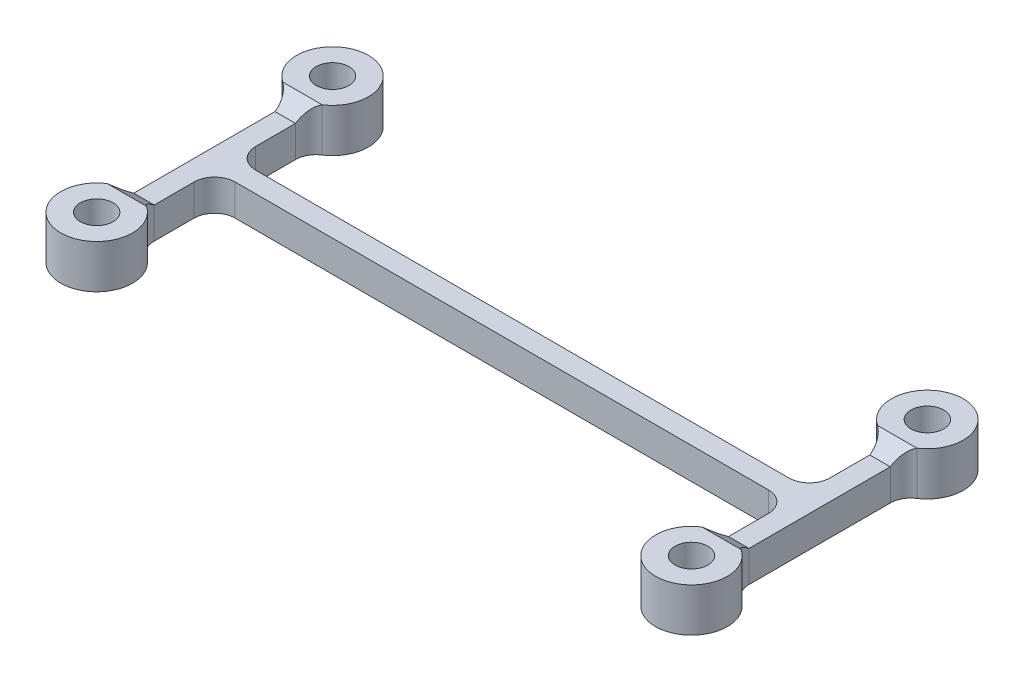
ISO-10303-21;
HEADER;
FILE_DESCRIPTION(('STEP AP214'),'2;1');
FILE_NAME('part.step','',(''),(''),'','','');
FILE_SCHEMA(('AUTOMOTIVE_DESIGN { 1 0 10303 214 1 1 1 1 }'));
ENDSEC;
DATA;
#1=APPLICATION_CONTEXT('core data for automotive mechanical design processes');
#2=APPLICATION_PROTOCOL_DEFINITION('international standard','automotive_design',2000,#1);
#3=PRODUCT_CONTEXT('',#1,'mechanical');
#4=PRODUCT('Part','Part','',(#3));
#5=PRODUCT_RELATED_PRODUCT_CATEGORY('part','',(#4));
#6=PRODUCT_DEFINITION_FORMATION('','',#4);
#7=PRODUCT_DEFINITION_CONTEXT('part definition',#1,'design');
#8=PRODUCT_DEFINITION('design','',#6,#7);
#9=PRODUCT_DEFINITION_SHAPE('','',#8);
#10=(LENGTH_UNIT() NAMED_UNIT(*) SI_UNIT(.MILLI.,.METRE.));
#11=(NAMED_UNIT(*) PLANE_ANGLE_UNIT() SI_UNIT($,.RADIAN.));
#12=(NAMED_UNIT(*) SI_UNIT($,.STERADIAN.) SOLID_ANGLE_UNIT());
#13=UNCERTAINTY_MEASURE_WITH_UNIT(LENGTH_MEASURE(1.E-05),#10,'distance_accuracy_value','');
#14=(GEOMETRIC_REPRESENTATION_CONTEXT(3) GLOBAL_UNCERTAINTY_ASSIGNED_CONTEXT((#13)) GLOBAL_UNIT_ASSIGNED_CONTEXT((#10,
#11,#12)) REPRESENTATION_CONTEXT('',''));
#15=CARTESIAN_POINT('',(0.,0.,0.));
#16=DIRECTION('',(0.,0.,1.));
#17=DIRECTION('',(1.,0.,0.));
#18=AXIS2_PLACEMENT_3D('',#15,#16,#17);
#19=CARTESIAN_POINT('',(32.,4.25,8.20884692923629));
#20=DIRECTION('',(0.,-1.,0.));
#21=DIRECTION('',(0.,0.,-1.));
#22=AXIS2_PLACEMENT_3D('',#19,#20,#21);
#23=PLANE('',#22);
#24=CARTESIAN_POINT('',(29.,4.25,12.8186191578828));
#25=DIRECTION('',(0.,1.,0.));
#26=DIRECTION('',(0.,0.,1.));
#27=AXIS2_PLACEMENT_3D('',#24,#25,#26);
#28=CIRCLE('',#27,1.6);
#29=CARTESIAN_POINT('',(29.,4.25,14.4186191578828));
#30=VERTEX_POINT('',#29);
#31=EDGE_CURVE('E405',#30,#30,#28,.T.);
#32=ORIENTED_EDGE('',*,*,#31,.F.);
#33=EDGE_LOOP('',(#32));
#34=FACE_BOUND('',#33,.T.);
#35=CARTESIAN_POINT('',(29.,4.25,12.8186191578828));
#36=DIRECTION('',(0.,1.,0.));
#37=DIRECTION('',(0.,0.,1.));
#38=AXIS2_PLACEMENT_3D('',#35,#36,#37);
#39=CIRCLE('',#38,3.5);
#40=CARTESIAN_POINT('',(27.0909090909091,4.25,9.88512773965318));
#41=VERTEX_POINT('',#40);
#42=CARTESIAN_POINT('',(30.9090909090909,4.25,9.88512773965318));
#43=VERTEX_POINT('',#42);
#44=EDGE_CURVE('E147',#41,#43,#39,.T.);
#45=ORIENTED_EDGE('',*,*,#44,.T.);
#46=DIRECTION('',(-1.,0.,0.));
#47=VECTOR('',#46,1.);
#48=CARTESIAN_POINT('',(32.,4.25,9.88512773965318));
#49=LINE('',#48,#47);
#50=EDGE_CURVE('E11',#43,#41,#49,.T.);
#51=ORIENTED_EDGE('',*,*,#50,.T.);
#52=EDGE_LOOP('',(#45,#51));
#53=FACE_BOUND('',#52,.T.);
#54=ADVANCED_FACE('F33',(#34,#53),#23,.F.);
#55=CARTESIAN_POINT('',(-29.,4.25,12.8186191578828));
#56=DIRECTION('',(0.,1.,0.));
#57=DIRECTION('',(0.,0.,1.));
#58=AXIS2_PLACEMENT_3D('',#55,#56,#57);
#59=CIRCLE('',#58,1.6);
#60=CARTESIAN_POINT('',(-29.,4.25,14.4186191578828));
#61=VERTEX_POINT('',#60);
#62=EDGE_CURVE('E387',#61,#61,#59,.T.);
#63=ORIENTED_EDGE('',*,*,#62,.F.);
#64=EDGE_LOOP('',(#63));
#65=FACE_BOUND('',#64,.T.);
#66=CARTESIAN_POINT('',(-29.,4.25,12.8186191578828));
#67=DIRECTION('',(0.,1.,0.));
#68=DIRECTION('',(0.,0.,1.));
#69=AXIS2_PLACEMENT_3D('',#66,#67,#68);
#70=CIRCLE('',#69,3.5);
#71=CARTESIAN_POINT('',(-30.9090909090909,4.25,9.88512773965318));
#72=VERTEX_POINT('',#71);
#73=CARTESIAN_POINT('',(-27.0909090909091,4.25,9.88512773965318));
#74=VERTEX_POINT('',#73);
#75=EDGE_CURVE('E230',#72,#74,#70,.T.);
#76=ORIENTED_EDGE('',*,*,#75,.T.);
#77=EDGE_CURVE('E37',#74,#72,#49,.T.);
#78=ORIENTED_EDGE('',*,*,#77,.T.);
#79=EDGE_LOOP('',(#76,#78));
#80=FACE_BOUND('',#79,.T.);
#81=ADVANCED_FACE('F227',(#65,#80),#23,.F.);
#82=CARTESIAN_POINT('',(-29.,4.25,-10.1813808421173));
#83=DIRECTION('',(0.,1.,0.));
#84=DIRECTION('',(0.,0.,1.));
#85=AXIS2_PLACEMENT_3D('',#82,#83,#84);
#86=CIRCLE('',#85,1.6);
#87=CARTESIAN_POINT('',(-29.,4.25,-8.58138084211725));
#88=VERTEX_POINT('',#87);
#89=EDGE_CURVE('E393',#88,#88,#86,.T.);
#90=ORIENTED_EDGE('',*,*,#89,.F.);
#91=EDGE_LOOP('',(#90));
#92=FACE_BOUND('',#91,.T.);
#93=CARTESIAN_POINT('',(-29.,4.25,-10.1813808421173));
#94=DIRECTION('',(0.,1.,0.));
#95=DIRECTION('',(0.,0.,1.));
#96=AXIS2_PLACEMENT_3D('',#93,#94,#95);
#97=CIRCLE('',#96,3.5);
#98=CARTESIAN_POINT('',(-27.0909090909091,4.25,-7.2478894238877));
#99=VERTEX_POINT('',#98);
#100=CARTESIAN_POINT('',(-30.9090909090909,4.25,-7.2478894238877));
#101=VERTEX_POINT('',#100);
#102=EDGE_CURVE('E158',#99,#101,#97,.T.);
#103=ORIENTED_EDGE('',*,*,#102,.T.);
#104=DIRECTION('',(1.,0.,0.));
#105=VECTOR('',#104,1.);
#106=CARTESIAN_POINT('',(32.,4.25,-7.2478894238877));
#107=LINE('',#106,#105);
#108=EDGE_CURVE('E212',#101,#99,#107,.T.);
#109=ORIENTED_EDGE('',*,*,#108,.T.);
#110=EDGE_LOOP('',(#103,#109));
#111=FACE_BOUND('',#110,.T.);
#112=ADVANCED_FACE('F530',(#92,#111),#23,.F.);
#113=CARTESIAN_POINT('',(32.,4.25,8.20884692923629));
#114=DIRECTION('',(0.,-1.,0.));
#115=DIRECTION('',(0.,0.,-1.));
#116=AXIS2_PLACEMENT_3D('',#113,#114,#115);
#117=CYLINDRICAL_SURFACE('',#116,2.);
#118=DIRECTION('',(0.,-1.,0.));
#119=VECTOR('',#118,1.);
#120=CARTESIAN_POINT('',(30.,4.25,8.20884692923629));
#121=LINE('',#120,#119);
#122=CARTESIAN_POINT('',(30.,3.05547270683732,8.20884692923629));
#123=VERTEX_POINT('',#122);
#124=CARTESIAN_POINT('',(30.,0.,8.20884692923629));
#125=VERTEX_POINT('',#124);
#126=EDGE_CURVE('E210',#123,#125,#121,.T.);
#127=ORIENTED_EDGE('',*,*,#126,.F.);
#128=CARTESIAN_POINT('',(32.,3.05547270683732,8.20884692923629));
#129=DIRECTION('',(0.,-0.81438006686052,0.580331893574923));
#130=DIRECTION('',(0.,-0.580331893574923,-0.81438006686052));
#131=AXIS2_PLACEMENT_3D('',#128,#129,#130);
#132=ELLIPSE('',#131,2.4558557869793,2.);
#133=EDGE_CURVE('E352',#123,#43,#132,.F.);
#134=ORIENTED_EDGE('',*,*,#133,.T.);
#135=DIRECTION('',(0.,-1.,0.));
#136=VECTOR('',#135,1.);
#137=CARTESIAN_POINT('',(30.9090909090909,4.25,9.88512773965318));
#138=LINE('',#137,#136);
#139=CARTESIAN_POINT('',(30.9090909090909,0.,9.88512773965318));
#140=VERTEX_POINT('',#139);
#141=EDGE_CURVE('E148',#43,#140,#138,.T.);
#142=ORIENTED_EDGE('',*,*,#141,.T.);
#143=CARTESIAN_POINT('',(32.,0.,8.20884692923629));
#144=DIRECTION('',(0.,-1.,0.));
#145=DIRECTION('',(0.,0.,-1.));
#146=AXIS2_PLACEMENT_3D('',#143,#144,#145);
#147=CIRCLE('',#146,2.);
#148=EDGE_CURVE('E154',#140,#125,#147,.T.);
#149=ORIENTED_EDGE('',*,*,#148,.T.);
#150=EDGE_LOOP('',(#127,#134,#142,#149));
#151=FACE_BOUND('',#150,.T.);
#152=ADVANCED_FACE('F35',(#151),#117,.F.);
#153=CARTESIAN_POINT('',(30.,4.25,-5.57160861347081));
#154=DIRECTION('',(-1.,0.,0.));
#155=DIRECTION('',(0.,0.,1.));
#156=AXIS2_PLACEMENT_3D('',#153,#154,#155);
#157=PLANE('',#156);
#158=DIRECTION('',(0.,-1.,0.));
#159=VECTOR('',#158,1.);
#160=CARTESIAN_POINT('',(30.,4.25,-5.57160861347081));
#161=LINE('',#160,#159);
#162=CARTESIAN_POINT('',(30.,3.05547270683732,-5.57160861347081));
#163=VERTEX_POINT('',#162);
#164=CARTESIAN_POINT('',(30.,0.,-5.57160861347081));
#165=VERTEX_POINT('',#164);
#166=EDGE_CURVE('E208',#163,#165,#161,.T.);
#167=ORIENTED_EDGE('',*,*,#166,.F.);
#168=DIRECTION('',(0.,0.,1.));
#169=VECTOR('',#168,1.);
#170=CARTESIAN_POINT('',(30.,3.05547270683732,-5.57160861347081));
#171=LINE('',#170,#169);
#172=EDGE_CURVE('E384',#163,#123,#171,.T.);
#173=ORIENTED_EDGE('',*,*,#172,.T.);
#174=ORIENTED_EDGE('',*,*,#126,.T.);
#175=DIRECTION('',(0.,0.,-1.));
#176=VECTOR('',#175,1.);
#177=CARTESIAN_POINT('',(30.,0.,-5.57160861347081));
#178=LINE('',#177,#176);
#179=EDGE_CURVE('E254',#125,#165,#178,.T.);
#180=ORIENTED_EDGE('',*,*,#179,.T.);
#181=EDGE_LOOP('',(#167,#173,#174,#180));
#182=FACE_BOUND('',#181,.T.);
#183=ADVANCED_FACE('F446',(#182),#157,.F.);
#184=CARTESIAN_POINT('',(32.,4.25,-5.57160861347081));
#185=DIRECTION('',(0.,-1.,0.));
#186=DIRECTION('',(0.,0.,-1.));
#187=AXIS2_PLACEMENT_3D('',#184,#185,#186);
#188=CYLINDRICAL_SURFACE('',#187,2.);
#189=DIRECTION('',(0.,-1.,0.));
#190=VECTOR('',#189,1.);
#191=CARTESIAN_POINT('',(30.9090909090909,4.25,-7.2478894238877));
#192=LINE('',#191,#190);
#193=CARTESIAN_POINT('',(30.9090909090909,4.25,-7.2478894238877));
#194=VERTEX_POINT('',#193);
#195=CARTESIAN_POINT('',(30.9090909090909,0.,-7.2478894238877));
#196=VERTEX_POINT('',#195);
#197=EDGE_CURVE('E205',#194,#196,#192,.T.);
#198=ORIENTED_EDGE('',*,*,#197,.F.);
#199=CARTESIAN_POINT('',(32.,3.05547270683732,-5.57160861347081));
#200=DIRECTION('',(0.,-0.814380066860519,-0.580331893574924));
#201=DIRECTION('',(0.,-0.580331893574924,0.814380066860519));
#202=AXIS2_PLACEMENT_3D('',#199,#200,#201);
#203=ELLIPSE('',#202,2.45585578697931,2.);
#204=EDGE_CURVE('E49',#194,#163,#203,.F.);
#205=ORIENTED_EDGE('',*,*,#204,.T.);
#206=ORIENTED_EDGE('',*,*,#166,.T.);
#207=CARTESIAN_POINT('',(32.,0.,-5.57160861347081));
#208=DIRECTION('',(0.,-1.,0.));
#209=DIRECTION('',(0.,0.,-1.));
#210=AXIS2_PLACEMENT_3D('',#207,#208,#209);
#211=CIRCLE('',#210,2.);
#212=EDGE_CURVE('E258',#165,#196,#211,.T.);
#213=ORIENTED_EDGE('',*,*,#212,.T.);
#214=EDGE_LOOP('',(#198,#205,#206,#213));
#215=FACE_BOUND('',#214,.T.);
#216=ADVANCED_FACE('F451',(#215),#188,.F.);
#217=CARTESIAN_POINT('',(29.,4.25,-10.1813808421173));
#218=DIRECTION('',(0.,-1.,0.));
#219=DIRECTION('',(0.,0.,-1.));
#220=AXIS2_PLACEMENT_3D('',#217,#218,#219);
#221=CYLINDRICAL_SURFACE('',#220,3.5);
#222=CARTESIAN_POINT('',(29.,0.,-10.1813808421173));
#223=DIRECTION('',(0.,1.,0.));
#224=DIRECTION('',(0.,0.,1.));
#225=AXIS2_PLACEMENT_3D('',#222,#223,#224);
#226=CIRCLE('',#225,3.5);
#227=CARTESIAN_POINT('',(27.0909090909091,0.,-7.2478894238877));
#228=VERTEX_POINT('',#227);
#229=EDGE_CURVE('E260',#196,#228,#226,.T.);
#230=ORIENTED_EDGE('',*,*,#229,.T.);
#231=DIRECTION('',(0.,-1.,0.));
#232=VECTOR('',#231,1.);
#233=CARTESIAN_POINT('',(27.0909090909091,4.25,-7.2478894238877));
#234=LINE('',#233,#232);
#235=CARTESIAN_POINT('',(27.0909090909091,4.25,-7.2478894238877));
#236=VERTEX_POINT('',#235);
#237=EDGE_CURVE('E202',#236,#228,#234,.T.);
#238=ORIENTED_EDGE('',*,*,#237,.F.);
#239=CARTESIAN_POINT('',(29.,4.25,-10.1813808421173));
#240=DIRECTION('',(0.,1.,0.));
#241=DIRECTION('',(0.,0.,1.));
#242=AXIS2_PLACEMENT_3D('',#239,#240,#241);
#243=CIRCLE('',#242,3.5);
#244=EDGE_CURVE('E155',#194,#236,#243,.T.);
#245=ORIENTED_EDGE('',*,*,#244,.F.);
#246=ORIENTED_EDGE('',*,*,#197,.T.);
#247=EDGE_LOOP('',(#230,#238,#245,#246));
#248=FACE_BOUND('',#247,.T.);
#249=ADVANCED_FACE('F539',(#248),#221,.T.);
#250=CARTESIAN_POINT('',(26.,4.25,-5.57160861347081));
#251=DIRECTION('',(0.,-1.,0.));
#252=DIRECTION('',(0.,0.,-1.));
#253=AXIS2_PLACEMENT_3D('',#250,#251,#252);
#254=CYLINDRICAL_SURFACE('',#253,2.);
#255=DIRECTION('',(0.,-1.,0.));
#256=VECTOR('',#255,1.);
#257=CARTESIAN_POINT('',(28.,4.25,-5.57160861347081));
#258=LINE('',#257,#256);
#259=CARTESIAN_POINT('',(28.,3.05547270683732,-5.57160861347081));
#260=VERTEX_POINT('',#259);
#261=CARTESIAN_POINT('',(28.,0.,-5.57160861347081));
#262=VERTEX_POINT('',#261);
#263=EDGE_CURVE('E200',#260,#262,#258,.T.);
#264=ORIENTED_EDGE('',*,*,#263,.F.);
#265=CARTESIAN_POINT('',(26.,3.05547270683732,-5.57160861347081));
#266=DIRECTION('',(0.,-0.814380066860519,-0.580331893574924));
#267=DIRECTION('',(0.,-0.580331893574924,0.814380066860519));
#268=AXIS2_PLACEMENT_3D('',#265,#266,#267);
#269=ELLIPSE('',#268,2.45585578697931,2.);
#270=EDGE_CURVE('E453',#260,#236,#269,.F.);
#271=ORIENTED_EDGE('',*,*,#270,.T.);
#272=ORIENTED_EDGE('',*,*,#237,.T.);
#273=CARTESIAN_POINT('',(26.,0.,-5.57160861347081));
#274=DIRECTION('',(0.,-1.,0.));
#275=DIRECTION('',(0.,0.,1.));
#276=AXIS2_PLACEMENT_3D('',#273,#274,#275);
#277=CIRCLE('',#276,2.);
#278=EDGE_CURVE('E262',#228,#262,#277,.T.);
#279=ORIENTED_EDGE('',*,*,#278,.T.);
#280=EDGE_LOOP('',(#264,#271,#272,#279));
#281=FACE_BOUND('',#280,.T.);
#282=ADVANCED_FACE('F536',(#281),#254,.F.);
#283=CARTESIAN_POINT('',(28.,4.25,-5.57160861347081));
#284=DIRECTION('',(1.,0.,0.));
#285=DIRECTION('',(0.,0.,-1.));
#286=AXIS2_PLACEMENT_3D('',#283,#284,#285);
#287=PLANE('',#286);
#288=DIRECTION('',(0.,-1.,0.));
#289=VECTOR('',#288,1.);
#290=CARTESIAN_POINT('',(28.,4.25,-1.68138084211727));
#291=LINE('',#290,#289);
#292=CARTESIAN_POINT('',(28.,3.05547270683732,-1.68138084211727));
#293=VERTEX_POINT('',#292);
#294=CARTESIAN_POINT('',(28.,0.,-1.68138084211727));
#295=VERTEX_POINT('',#294);
#296=EDGE_CURVE('E198',#293,#295,#291,.T.);
#297=ORIENTED_EDGE('',*,*,#296,.F.);
#298=DIRECTION('',(0.,0.,-1.));
#299=VECTOR('',#298,1.);
#300=CARTESIAN_POINT('',(28.,3.05547270683732,-5.57160861347081));
#301=LINE('',#300,#299);
#302=EDGE_CURVE('E381',#293,#260,#301,.T.);
#303=ORIENTED_EDGE('',*,*,#302,.T.);
#304=ORIENTED_EDGE('',*,*,#263,.T.);
#305=DIRECTION('',(0.,0.,1.));
#306=VECTOR('',#305,1.);
#307=CARTESIAN_POINT('',(28.,0.,-5.57160861347081));
#308=LINE('',#307,#306);
#309=EDGE_CURVE('E265',#262,#295,#308,.T.);
#310=ORIENTED_EDGE('',*,*,#309,.T.);
#311=EDGE_LOOP('',(#297,#303,#304,#310));
#312=FACE_BOUND('',#311,.T.);
#313=ADVANCED_FACE('F495',(#312),#287,.F.);
#314=CARTESIAN_POINT('',(26.,4.25,-1.68138084211725));
#315=DIRECTION('',(0.,-1.,0.));
#316=DIRECTION('',(0.,0.,-1.));
#317=AXIS2_PLACEMENT_3D('',#314,#315,#316);
#318=CYLINDRICAL_SURFACE('',#317,2.);
#319=DIRECTION('',(0.,-1.,0.));
#320=VECTOR('',#319,1.);
#321=CARTESIAN_POINT('',(26.,4.25,0.318619157882749));
#322=LINE('',#321,#320);
#323=CARTESIAN_POINT('',(26.,3.05547270683732,0.318619157882749));
#324=VERTEX_POINT('',#323);
#325=CARTESIAN_POINT('',(26.,0.,0.318619157882749));
#326=VERTEX_POINT('',#325);
#327=EDGE_CURVE('E196',#324,#326,#322,.T.);
#328=ORIENTED_EDGE('',*,*,#327,.F.);
#329=CARTESIAN_POINT('',(26.,3.05547270683732,-1.68138084211725));
#330=DIRECTION('',(0.,-1.,0.));
#331=DIRECTION('',(0.,0.,-1.));
#332=AXIS2_PLACEMENT_3D('',#329,#330,#331);
#333=CIRCLE('',#332,2.);
#334=EDGE_CURVE('E378',#324,#293,#333,.F.);
#335=ORIENTED_EDGE('',*,*,#334,.T.);
#336=ORIENTED_EDGE('',*,*,#296,.T.);
#337=CARTESIAN_POINT('',(26.,0.,-1.68138084211725));
#338=DIRECTION('',(0.,-1.,0.));
#339=DIRECTION('',(0.,0.,1.));
#340=AXIS2_PLACEMENT_3D('',#337,#338,#339);
#341=CIRCLE('',#340,2.);
#342=EDGE_CURVE('E268',#295,#326,#341,.T.);
#343=ORIENTED_EDGE('',*,*,#342,.T.);
#344=EDGE_LOOP('',(#328,#335,#336,#343));
#345=FACE_BOUND('',#344,.T.);
#346=ADVANCED_FACE('F494',(#345),#318,.F.);
#347=CARTESIAN_POINT('',(-26.,4.25,0.318619157882749));
#348=DIRECTION('',(0.,0.,1.));
#349=DIRECTION('',(1.,0.,0.));
#350=AXIS2_PLACEMENT_3D('',#347,#348,#349);
#351=PLANE('',#350);
#352=DIRECTION('',(0.,-1.,0.));
#353=VECTOR('',#352,1.);
#354=CARTESIAN_POINT('',(-26.,4.25,0.318619157882749));
#355=LINE('',#354,#353);
#356=CARTESIAN_POINT('',(-26.,3.05547270683732,0.318619157882749));
#357=VERTEX_POINT('',#356);
#358=CARTESIAN_POINT('',(-26.,0.,0.318619157882749));
#359=VERTEX_POINT('',#358);
#360=EDGE_CURVE('E194',#357,#359,#355,.T.);
#361=ORIENTED_EDGE('',*,*,#360,.F.);
#362=DIRECTION('',(1.,0.,0.));
#363=VECTOR('',#362,1.);
#364=CARTESIAN_POINT('',(-26.,3.05547270683732,0.318619157882749));
#365=LINE('',#364,#363);
#366=EDGE_CURVE('E375',#357,#324,#365,.T.);
#367=ORIENTED_EDGE('',*,*,#366,.T.);
#368=ORIENTED_EDGE('',*,*,#327,.T.);
#369=DIRECTION('',(-1.,0.,0.));
#370=VECTOR('',#369,1.);
#371=CARTESIAN_POINT('',(-26.,0.,0.318619157882749));
#372=LINE('',#371,#370);
#373=EDGE_CURVE('E271',#326,#359,#372,.T.);
#374=ORIENTED_EDGE('',*,*,#373,.T.);
#375=EDGE_LOOP('',(#361,#367,#368,#374));
#376=FACE_BOUND('',#375,.T.);
#377=ADVANCED_FACE('F504',(#376),#351,.F.);
#378=CARTESIAN_POINT('',(-26.,4.25,-1.68138084211725));
#379=DIRECTION('',(0.,-1.,0.));
#380=DIRECTION('',(0.,0.,-1.));
#381=AXIS2_PLACEMENT_3D('',#378,#379,#380);
#382=CYLINDRICAL_SURFACE('',#381,2.);
#383=DIRECTION('',(0.,-1.,0.));
#384=VECTOR('',#383,1.);
#385=CARTESIAN_POINT('',(-28.,4.25,-1.68138084211727));
#386=LINE('',#385,#384);
#387=CARTESIAN_POINT('',(-28.,3.05547270683732,-1.68138084211727));
#388=VERTEX_POINT('',#387);
#389=CARTESIAN_POINT('',(-28.,0.,-1.68138084211727));
#390=VERTEX_POINT('',#389);
#391=EDGE_CURVE('E192',#388,#390,#386,.T.);
#392=ORIENTED_EDGE('',*,*,#391,.F.);
#393=CARTESIAN_POINT('',(-26.,3.05547270683732,-1.68138084211725));
#394=DIRECTION('',(0.,-1.,0.));
#395=DIRECTION('',(0.,0.,-1.));
#396=AXIS2_PLACEMENT_3D('',#393,#394,#395);
#397=CIRCLE('',#396,2.);
#398=EDGE_CURVE('E372',#388,#357,#397,.F.);
#399=ORIENTED_EDGE('',*,*,#398,.T.);
#400=ORIENTED_EDGE('',*,*,#360,.T.);
#401=CARTESIAN_POINT('',(-26.,0.,-1.68138084211725));
#402=DIRECTION('',(0.,-1.,0.));
#403=DIRECTION('',(0.,0.,-1.));
#404=AXIS2_PLACEMENT_3D('',#401,#402,#403);
#405=CIRCLE('',#404,2.);
#406=EDGE_CURVE('E274',#359,#390,#405,.T.);
#407=ORIENTED_EDGE('',*,*,#406,.T.);
#408=EDGE_LOOP('',(#392,#399,#400,#407));
#409=FACE_BOUND('',#408,.T.);
#410=ADVANCED_FACE('F508',(#409),#382,.F.);
#411=CARTESIAN_POINT('',(-28.,4.25,-5.57160861347081));
#412=DIRECTION('',(-1.,0.,0.));
#413=DIRECTION('',(0.,0.,1.));
#414=AXIS2_PLACEMENT_3D('',#411,#412,#413);
#415=PLANE('',#414);
#416=DIRECTION('',(0.,-1.,0.));
#417=VECTOR('',#416,1.);
#418=CARTESIAN_POINT('',(-28.,4.25,-5.57160861347081));
#419=LINE('',#418,#417);
#420=CARTESIAN_POINT('',(-28.,3.05547270683732,-5.57160861347081));
#421=VERTEX_POINT('',#420);
#422=CARTESIAN_POINT('',(-28.,0.,-5.57160861347081));
#423=VERTEX_POINT('',#422);
#424=EDGE_CURVE('E190',#421,#423,#419,.T.);
#425=ORIENTED_EDGE('',*,*,#424,.F.);
#426=DIRECTION('',(0.,0.,1.));
#427=VECTOR('',#426,1.);
#428=CARTESIAN_POINT('',(-28.,3.05547270683732,-5.57160861347081));
#429=LINE('',#428,#427);
#430=EDGE_CURVE('E369',#421,#388,#429,.T.);
#431=ORIENTED_EDGE('',*,*,#430,.T.);
#432=ORIENTED_EDGE('',*,*,#391,.T.);
#433=DIRECTION('',(0.,0.,-1.));
#434=VECTOR('',#433,1.);
#435=CARTESIAN_POINT('',(-28.,0.,-5.57160861347081));
#436=LINE('',#435,#434);
#437=EDGE_CURVE('E277',#390,#423,#436,.T.);
#438=ORIENTED_EDGE('',*,*,#437,.T.);
#439=EDGE_LOOP('',(#425,#431,#432,#438));
#440=FACE_BOUND('',#439,.T.);
#441=ADVANCED_FACE('F511',(#440),#415,.F.);
#442=CARTESIAN_POINT('',(-26.,4.25,-5.57160861347081));
#443=DIRECTION('',(0.,-1.,0.));
#444=DIRECTION('',(0.,0.,-1.));
#445=AXIS2_PLACEMENT_3D('',#442,#443,#444);
#446=CYLINDRICAL_SURFACE('',#445,2.);
#447=DIRECTION('',(0.,-1.,0.));
#448=VECTOR('',#447,1.);
#449=CARTESIAN_POINT('',(-27.0909090909091,4.25,-7.2478894238877));
#450=LINE('',#449,#448);
#451=CARTESIAN_POINT('',(-27.0909090909091,0.,-7.2478894238877));
#452=VERTEX_POINT('',#451);
#453=EDGE_CURVE('E187',#99,#452,#450,.T.);
#454=ORIENTED_EDGE('',*,*,#453,.F.);
#455=CARTESIAN_POINT('',(-26.,3.05547270683732,-5.57160861347081));
#456=DIRECTION('',(0.,-0.814380066860519,-0.580331893574924));
#457=DIRECTION('',(0.,-0.580331893574924,0.814380066860519));
#458=AXIS2_PLACEMENT_3D('',#455,#456,#457);
#459=ELLIPSE('',#458,2.45585578697931,2.);
#460=EDGE_CURVE('E455',#99,#421,#459,.F.);
#461=ORIENTED_EDGE('',*,*,#460,.T.);
#462=ORIENTED_EDGE('',*,*,#424,.T.);
#463=CARTESIAN_POINT('',(-26.,0.,-5.57160861347081));
#464=DIRECTION('',(0.,-1.,0.));
#465=DIRECTION('',(0.,0.,1.));
#466=AXIS2_PLACEMENT_3D('',#463,#464,#465);
#467=CIRCLE('',#466,2.);
#468=EDGE_CURVE('E280',#423,#452,#467,.T.);
#469=ORIENTED_EDGE('',*,*,#468,.T.);
#470=EDGE_LOOP('',(#454,#461,#462,#469));
#471=FACE_BOUND('',#470,.T.);
#472=ADVANCED_FACE('F521',(#471),#446,.F.);
#473=CARTESIAN_POINT('',(-29.,4.25,-10.1813808421173));
#474=DIRECTION('',(0.,-1.,0.));
#475=DIRECTION('',(0.,0.,-1.));
#476=AXIS2_PLACEMENT_3D('',#473,#474,#475);
#477=CYLINDRICAL_SURFACE('',#476,3.5);
#478=CARTESIAN_POINT('',(-29.,0.,-10.1813808421173));
#479=DIRECTION('',(0.,1.,0.));
#480=DIRECTION('',(0.,0.,1.));
#481=AXIS2_PLACEMENT_3D('',#478,#479,#480);
#482=CIRCLE('',#481,3.5);
#483=CARTESIAN_POINT('',(-30.9090909090909,0.,-7.2478894238877));
#484=VERTEX_POINT('',#483);
#485=EDGE_CURVE('E282',#452,#484,#482,.T.);
#486=ORIENTED_EDGE('',*,*,#485,.T.);
#487=DIRECTION('',(0.,-1.,0.));
#488=VECTOR('',#487,1.);
#489=CARTESIAN_POINT('',(-30.9090909090909,4.25,-7.2478894238877));
#490=LINE('',#489,#488);
#491=EDGE_CURVE('E184',#101,#484,#490,.T.);
#492=ORIENTED_EDGE('',*,*,#491,.F.);
#493=ORIENTED_EDGE('',*,*,#102,.F.);
#494=ORIENTED_EDGE('',*,*,#453,.T.);
#495=EDGE_LOOP('',(#486,#492,#493,#494));
#496=FACE_BOUND('',#495,.T.);
#497=ADVANCED_FACE('F529',(#496),#477,.T.);
#498=CARTESIAN_POINT('',(-32.,4.25,-5.57160861347081));
#499=DIRECTION('',(0.,-1.,0.));
#500=DIRECTION('',(0.,0.,-1.));
#501=AXIS2_PLACEMENT_3D('',#498,#499,#500);
#502=CYLINDRICAL_SURFACE('',#501,2.);
#503=DIRECTION('',(0.,-1.,0.));
#504=VECTOR('',#503,1.);
#505=CARTESIAN_POINT('',(-30.,4.25,-5.57160861347081));
#506=LINE('',#505,#504);
#507=CARTESIAN_POINT('',(-30.,3.05547270683732,-5.57160861347081));
#508=VERTEX_POINT('',#507);
#509=CARTESIAN_POINT('',(-30.,0.,-5.57160861347081));
#510=VERTEX_POINT('',#509);
#511=EDGE_CURVE('E182',#508,#510,#506,.T.);
#512=ORIENTED_EDGE('',*,*,#511,.F.);
#513=CARTESIAN_POINT('',(-32.,3.05547270683732,-5.57160861347081));
#514=DIRECTION('',(0.,-0.814380066860519,-0.580331893574924));
#515=DIRECTION('',(0.,-0.580331893574924,0.814380066860519));
#516=AXIS2_PLACEMENT_3D('',#513,#514,#515);
#517=ELLIPSE('',#516,2.45585578697931,2.);
#518=EDGE_CURVE('E460',#508,#101,#517,.F.);
#519=ORIENTED_EDGE('',*,*,#518,.T.);
#520=ORIENTED_EDGE('',*,*,#491,.T.);
#521=CARTESIAN_POINT('',(-32.,0.,-5.57160861347081));
#522=DIRECTION('',(0.,-1.,0.));
#523=DIRECTION('',(0.,0.,1.));
#524=AXIS2_PLACEMENT_3D('',#521,#522,#523);
#525=CIRCLE('',#524,2.);
#526=EDGE_CURVE('E284',#484,#510,#525,.T.);
#527=ORIENTED_EDGE('',*,*,#526,.T.);
#528=EDGE_LOOP('',(#512,#519,#520,#527));
#529=FACE_BOUND('',#528,.T.);
#530=ADVANCED_FACE('F716',(#529),#502,.F.);
#531=CARTESIAN_POINT('',(-30.,4.25,-5.57160861347081));
#532=DIRECTION('',(1.,0.,0.));
#533=DIRECTION('',(0.,0.,-1.));
#534=AXIS2_PLACEMENT_3D('',#531,#532,#533);
#535=PLANE('',#534);
#536=DIRECTION('',(0.,-1.,0.));
#537=VECTOR('',#536,1.);
#538=CARTESIAN_POINT('',(-30.,4.25,8.20884692923633));
#539=LINE('',#538,#537);
#540=CARTESIAN_POINT('',(-30.,3.05547270683732,8.20884692923629));
#541=VERTEX_POINT('',#540);
#542=CARTESIAN_POINT('',(-30.,0.,8.20884692923633));
#543=VERTEX_POINT('',#542);
#544=EDGE_CURVE('E180',#541,#543,#539,.T.);
#545=ORIENTED_EDGE('',*,*,#544,.F.);
#546=DIRECTION('',(0.,0.,-1.));
#547=VECTOR('',#546,1.);
#548=CARTESIAN_POINT('',(-30.,3.05547270683732,-5.57160861347081));
#549=LINE('',#548,#547);
#550=EDGE_CURVE('E366',#541,#508,#549,.T.);
#551=ORIENTED_EDGE('',*,*,#550,.T.);
#552=ORIENTED_EDGE('',*,*,#511,.T.);
#553=DIRECTION('',(0.,0.,1.));
#554=VECTOR('',#553,1.);
#555=CARTESIAN_POINT('',(-30.,0.,-5.57160861347081));
#556=LINE('',#555,#554);
#557=EDGE_CURVE('E287',#510,#543,#556,.T.);
#558=ORIENTED_EDGE('',*,*,#557,.T.);
#559=EDGE_LOOP('',(#545,#551,#552,#558));
#560=FACE_BOUND('',#559,.T.);
#561=ADVANCED_FACE('F708',(#560),#535,.F.);
#562=CARTESIAN_POINT('',(-32.,4.25,8.20884692923633));
#563=DIRECTION('',(0.,-1.,0.));
#564=DIRECTION('',(0.,0.,-1.));
#565=AXIS2_PLACEMENT_3D('',#562,#563,#564);
#566=CYLINDRICAL_SURFACE('',#565,2.);
#567=DIRECTION('',(0.,-1.,0.));
#568=VECTOR('',#567,1.);
#569=CARTESIAN_POINT('',(-30.9090909090909,4.25,9.88512773965321));
#570=LINE('',#569,#568);
#571=CARTESIAN_POINT('',(-30.9090909090909,0.,9.88512773965321));
#572=VERTEX_POINT('',#571);
#573=EDGE_CURVE('E177',#72,#572,#570,.T.);
#574=ORIENTED_EDGE('',*,*,#573,.F.);
#575=CARTESIAN_POINT('',(-32.,3.05547270683734,8.20884692923633));
#576=DIRECTION('',(0.,-0.81438006686052,0.580331893574923));
#577=DIRECTION('',(0.,-0.580331893574923,-0.81438006686052));
#578=AXIS2_PLACEMENT_3D('',#575,#576,#577);
#579=ELLIPSE('',#578,2.45585578697931,2.);
#580=EDGE_CURVE('E242',#72,#541,#579,.F.);
#581=ORIENTED_EDGE('',*,*,#580,.T.);
#582=ORIENTED_EDGE('',*,*,#544,.T.);
#583=CARTESIAN_POINT('',(-32.,0.,8.20884692923633));
#584=DIRECTION('',(0.,-1.,0.));
#585=DIRECTION('',(0.,0.,1.));
#586=AXIS2_PLACEMENT_3D('',#583,#584,#585);
#587=CIRCLE('',#586,2.);
#588=EDGE_CURVE('E245',#543,#572,#587,.T.);
#589=ORIENTED_EDGE('',*,*,#588,.T.);
#590=EDGE_LOOP('',(#574,#581,#582,#589));
#591=FACE_BOUND('',#590,.T.);
#592=ADVANCED_FACE('F240',(#591),#566,.F.);
#593=CARTESIAN_POINT('',(-29.,4.25,12.8186191578828));
#594=DIRECTION('',(0.,-1.,0.));
#595=DIRECTION('',(0.,0.,-1.));
#596=AXIS2_PLACEMENT_3D('',#593,#594,#595);
#597=CYLINDRICAL_SURFACE('',#596,3.5);
#598=CARTESIAN_POINT('',(-29.,0.,12.8186191578828));
#599=DIRECTION('',(0.,1.,0.));
#600=DIRECTION('',(0.,0.,1.));
#601=AXIS2_PLACEMENT_3D('',#598,#599,#600);
#602=CIRCLE('',#601,3.5);
#603=CARTESIAN_POINT('',(-27.0909090909091,0.,9.88512773965319));
#604=VERTEX_POINT('',#603);
#605=EDGE_CURVE('E291',#572,#604,#602,.T.);
#606=ORIENTED_EDGE('',*,*,#605,.T.);
#607=DIRECTION('',(0.,-1.,0.));
#608=VECTOR('',#607,1.);
#609=CARTESIAN_POINT('',(-27.0909090909091,4.25,9.88512773965319));
#610=LINE('',#609,#608);
#611=EDGE_CURVE('E174',#74,#604,#610,.T.);
#612=ORIENTED_EDGE('',*,*,#611,.F.);
#613=ORIENTED_EDGE('',*,*,#75,.F.);
#614=ORIENTED_EDGE('',*,*,#573,.T.);
#615=EDGE_LOOP('',(#606,#612,#613,#614));
#616=FACE_BOUND('',#615,.T.);
#617=ADVANCED_FACE('F248',(#616),#597,.T.);
#618=CARTESIAN_POINT('',(-26.,4.25,8.20884692923629));
#619=DIRECTION('',(0.,-1.,0.));
#620=DIRECTION('',(0.,0.,-1.));
#621=AXIS2_PLACEMENT_3D('',#618,#619,#620);
#622=CYLINDRICAL_SURFACE('',#621,2.);
#623=DIRECTION('',(0.,-1.,0.));
#624=VECTOR('',#623,1.);
#625=CARTESIAN_POINT('',(-28.,4.25,8.20884692923629));
#626=LINE('',#625,#624);
#627=CARTESIAN_POINT('',(-28.,3.05547270683732,8.20884692923629));
#628=VERTEX_POINT('',#627);
#629=CARTESIAN_POINT('',(-28.,0.,8.20884692923629));
#630=VERTEX_POINT('',#629);
#631=EDGE_CURVE('E172',#628,#630,#626,.T.);
#632=ORIENTED_EDGE('',*,*,#631,.F.);
#633=CARTESIAN_POINT('',(-26.,3.05547270683732,8.20884692923629));
#634=DIRECTION('',(0.,-0.81438006686052,0.580331893574923));
#635=DIRECTION('',(0.,-0.580331893574923,-0.81438006686052));
#636=AXIS2_PLACEMENT_3D('',#633,#634,#635);
#637=ELLIPSE('',#636,2.4558557869793,2.);
#638=EDGE_CURVE('E346',#628,#74,#637,.F.);
#639=ORIENTED_EDGE('',*,*,#638,.T.);
#640=ORIENTED_EDGE('',*,*,#611,.T.);
#641=CARTESIAN_POINT('',(-26.,0.,8.20884692923629));
#642=DIRECTION('',(0.,-1.,0.));
#643=DIRECTION('',(0.,0.,-1.));
#644=AXIS2_PLACEMENT_3D('',#641,#642,#643);
#645=CIRCLE('',#644,2.);
#646=EDGE_CURVE('E293',#604,#630,#645,.T.);
#647=ORIENTED_EDGE('',*,*,#646,.T.);
#648=EDGE_LOOP('',(#632,#639,#640,#647));
#649=FACE_BOUND('',#648,.T.);
#650=ADVANCED_FACE('F345',(#649),#622,.F.);
#651=CARTESIAN_POINT('',(-28.,4.25,4.31861915788276));
#652=DIRECTION('',(-1.,0.,0.));
#653=DIRECTION('',(0.,0.,1.));
#654=AXIS2_PLACEMENT_3D('',#651,#652,#653);
#655=PLANE('',#654);
#656=DIRECTION('',(0.,-1.,0.));
#657=VECTOR('',#656,1.);
#658=CARTESIAN_POINT('',(-28.,4.25,4.31861915788276));
#659=LINE('',#658,#657);
#660=CARTESIAN_POINT('',(-28.,3.05547270683732,4.31861915788276));
#661=VERTEX_POINT('',#660);
#662=CARTESIAN_POINT('',(-28.,0.,4.31861915788276));
#663=VERTEX_POINT('',#662);
#664=EDGE_CURVE('E170',#661,#663,#659,.T.);
#665=ORIENTED_EDGE('',*,*,#664,.F.);
#666=DIRECTION('',(0.,0.,1.));
#667=VECTOR('',#666,1.);
#668=CARTESIAN_POINT('',(-28.,3.05547270683732,4.31861915788276));
#669=LINE('',#668,#667);
#670=EDGE_CURVE('E343',#661,#628,#669,.T.);
#671=ORIENTED_EDGE('',*,*,#670,.T.);
#672=ORIENTED_EDGE('',*,*,#631,.T.);
#673=DIRECTION('',(0.,0.,-1.));
#674=VECTOR('',#673,1.);
#675=CARTESIAN_POINT('',(-28.,0.,4.31861915788276));
#676=LINE('',#675,#674);
#677=EDGE_CURVE('E296',#630,#663,#676,.T.);
#678=ORIENTED_EDGE('',*,*,#677,.T.);
#679=EDGE_LOOP('',(#665,#671,#672,#678));
#680=FACE_BOUND('',#679,.T.);
#681=ADVANCED_FACE('F337',(#680),#655,.F.);
#682=CARTESIAN_POINT('',(-26.,4.25,4.31861915788275));
#683=DIRECTION('',(0.,-1.,0.));
#684=DIRECTION('',(0.,0.,-1.));
#685=AXIS2_PLACEMENT_3D('',#682,#683,#684);
#686=CYLINDRICAL_SURFACE('',#685,2.);
#687=DIRECTION('',(0.,-1.,0.));
#688=VECTOR('',#687,1.);
#689=CARTESIAN_POINT('',(-26.,4.25,2.31861915788275));
#690=LINE('',#689,#688);
#691=CARTESIAN_POINT('',(-26.,3.05547270683732,2.31861915788275));
#692=VERTEX_POINT('',#691);
#693=CARTESIAN_POINT('',(-26.,0.,2.31861915788275));
#694=VERTEX_POINT('',#693);
#695=EDGE_CURVE('E168',#692,#694,#690,.T.);
#696=ORIENTED_EDGE('',*,*,#695,.F.);
#697=CARTESIAN_POINT('',(-26.,3.05547270683732,4.31861915788275));
#698=DIRECTION('',(0.,-1.,0.));
#699=DIRECTION('',(0.,0.,-1.));
#700=AXIS2_PLACEMENT_3D('',#697,#698,#699);
#701=CIRCLE('',#700,2.);
#702=EDGE_CURVE('E363',#692,#661,#701,.F.);
#703=ORIENTED_EDGE('',*,*,#702,.T.);
#704=ORIENTED_EDGE('',*,*,#664,.T.);
#705=CARTESIAN_POINT('',(-26.,0.,4.31861915788275));
#706=DIRECTION('',(0.,-1.,0.));
#707=DIRECTION('',(0.,0.,1.));
#708=AXIS2_PLACEMENT_3D('',#705,#706,#707);
#709=CIRCLE('',#708,2.);
#710=EDGE_CURVE('E299',#663,#694,#709,.T.);
#711=ORIENTED_EDGE('',*,*,#710,.T.);
#712=EDGE_LOOP('',(#696,#703,#704,#711));
#713=FACE_BOUND('',#712,.T.);
#714=ADVANCED_FACE('F332',(#713),#686,.F.);
#715=CARTESIAN_POINT('',(-26.,4.25,2.31861915788275));
#716=DIRECTION('',(0.,0.,-1.));
#717=DIRECTION('',(-1.,0.,0.));
#718=AXIS2_PLACEMENT_3D('',#715,#716,#717);
#719=PLANE('',#718);
#720=DIRECTION('',(0.,-1.,0.));
#721=VECTOR('',#720,1.);
#722=CARTESIAN_POINT('',(26.,4.25,2.31861915788275));
#723=LINE('',#722,#721);
#724=CARTESIAN_POINT('',(26.,3.05547270683732,2.31861915788275));
#725=VERTEX_POINT('',#724);
#726=CARTESIAN_POINT('',(26.,0.,2.31861915788275));
#727=VERTEX_POINT('',#726);
#728=EDGE_CURVE('E166',#725,#727,#723,.T.);
#729=ORIENTED_EDGE('',*,*,#728,.F.);
#730=DIRECTION('',(-1.,0.,0.));
#731=VECTOR('',#730,1.);
#732=CARTESIAN_POINT('',(-26.,3.05547270683732,2.31861915788275));
#733=LINE('',#732,#731);
#734=EDGE_CURVE('E329',#725,#692,#733,.T.);
#735=ORIENTED_EDGE('',*,*,#734,.T.);
#736=ORIENTED_EDGE('',*,*,#695,.T.);
#737=DIRECTION('',(1.,0.,0.));
#738=VECTOR('',#737,1.);
#739=CARTESIAN_POINT('',(-26.,0.,2.31861915788275));
#740=LINE('',#739,#738);
#741=EDGE_CURVE('E302',#694,#727,#740,.T.);
#742=ORIENTED_EDGE('',*,*,#741,.T.);
#743=EDGE_LOOP('',(#729,#735,#736,#742));
#744=FACE_BOUND('',#743,.T.);
#745=ADVANCED_FACE('F325',(#744),#719,.F.);
#746=CARTESIAN_POINT('',(26.,4.25,4.31861915788275));
#747=DIRECTION('',(0.,-1.,0.));
#748=DIRECTION('',(0.,0.,-1.));
#749=AXIS2_PLACEMENT_3D('',#746,#747,#748);
#750=CYLINDRICAL_SURFACE('',#749,2.);
#751=DIRECTION('',(0.,-1.,0.));
#752=VECTOR('',#751,1.);
#753=CARTESIAN_POINT('',(28.,4.25,4.31861915788276));
#754=LINE('',#753,#752);
#755=CARTESIAN_POINT('',(28.,3.05547270683732,4.31861915788276));
#756=VERTEX_POINT('',#755);
#757=CARTESIAN_POINT('',(28.,0.,4.31861915788276));
#758=VERTEX_POINT('',#757);
#759=EDGE_CURVE('E164',#756,#758,#754,.T.);
#760=ORIENTED_EDGE('',*,*,#759,.F.);
#761=CARTESIAN_POINT('',(26.,3.05547270683732,4.31861915788275));
#762=DIRECTION('',(0.,-1.,0.));
#763=DIRECTION('',(0.,0.,-1.));
#764=AXIS2_PLACEMENT_3D('',#761,#762,#763);
#765=CIRCLE('',#764,2.);
#766=EDGE_CURVE('E322',#756,#725,#765,.F.);
#767=ORIENTED_EDGE('',*,*,#766,.T.);
#768=ORIENTED_EDGE('',*,*,#728,.T.);
#769=CARTESIAN_POINT('',(26.,0.,4.31861915788275));
#770=DIRECTION('',(0.,-1.,0.));
#771=DIRECTION('',(0.,0.,1.));
#772=AXIS2_PLACEMENT_3D('',#769,#770,#771);
#773=CIRCLE('',#772,2.);
#774=EDGE_CURVE('E305',#727,#758,#773,.T.);
#775=ORIENTED_EDGE('',*,*,#774,.T.);
#776=EDGE_LOOP('',(#760,#767,#768,#775));
#777=FACE_BOUND('',#776,.T.);
#778=ADVANCED_FACE('F316',(#777),#750,.F.);
#779=CARTESIAN_POINT('',(28.,4.25,4.31861915788276));
#780=DIRECTION('',(1.,0.,0.));
#781=DIRECTION('',(0.,0.,-1.));
#782=AXIS2_PLACEMENT_3D('',#779,#780,#781);
#783=PLANE('',#782);
#784=DIRECTION('',(0.,-1.,0.));
#785=VECTOR('',#784,1.);
#786=CARTESIAN_POINT('',(28.,4.25,8.20884692923633));
#787=LINE('',#786,#785);
#788=CARTESIAN_POINT('',(28.,3.05547270683732,8.20884692923629));
#789=VERTEX_POINT('',#788);
#790=CARTESIAN_POINT('',(28.,0.,8.20884692923633));
#791=VERTEX_POINT('',#790);
#792=EDGE_CURVE('E134',#789,#791,#787,.T.);
#793=ORIENTED_EDGE('',*,*,#792,.F.);
#794=DIRECTION('',(0.,0.,-1.));
#795=VECTOR('',#794,1.);
#796=CARTESIAN_POINT('',(28.,3.05547270683732,4.31861915788276));
#797=LINE('',#796,#795);
#798=EDGE_CURVE('E359',#789,#756,#797,.T.);
#799=ORIENTED_EDGE('',*,*,#798,.T.);
#800=ORIENTED_EDGE('',*,*,#759,.T.);
#801=DIRECTION('',(0.,0.,1.));
#802=VECTOR('',#801,1.);
#803=CARTESIAN_POINT('',(28.,0.,4.31861915788276));
#804=LINE('',#803,#802);
#805=EDGE_CURVE('E140',#758,#791,#804,.T.);
#806=ORIENTED_EDGE('',*,*,#805,.T.);
#807=EDGE_LOOP('',(#793,#799,#800,#806));
#808=FACE_BOUND('',#807,.T.);
#809=ADVANCED_FACE('F308',(#808),#783,.F.);
#810=CARTESIAN_POINT('',(26.,4.25,8.20884692923633));
#811=DIRECTION('',(0.,-1.,0.));
#812=DIRECTION('',(0.,0.,-1.));
#813=AXIS2_PLACEMENT_3D('',#810,#811,#812);
#814=CYLINDRICAL_SURFACE('',#813,2.);
#815=DIRECTION('',(0.,-1.,0.));
#816=VECTOR('',#815,1.);
#817=CARTESIAN_POINT('',(27.0909090909091,4.25,9.88512773965321));
#818=LINE('',#817,#816);
#819=CARTESIAN_POINT('',(27.0909090909091,0.,9.88512773965321));
#820=VERTEX_POINT('',#819);
#821=EDGE_CURVE('E131',#41,#820,#818,.T.);
#822=ORIENTED_EDGE('',*,*,#821,.F.);
#823=CARTESIAN_POINT('',(26.,3.05547270683734,8.20884692923633));
#824=DIRECTION('',(0.,-0.81438006686052,0.580331893574923));
#825=DIRECTION('',(0.,-0.580331893574923,-0.81438006686052));
#826=AXIS2_PLACEMENT_3D('',#823,#824,#825);
#827=ELLIPSE('',#826,2.45585578697931,2.);
#828=EDGE_CURVE('E350',#41,#789,#827,.F.);
#829=ORIENTED_EDGE('',*,*,#828,.T.);
#830=ORIENTED_EDGE('',*,*,#792,.T.);
#831=CARTESIAN_POINT('',(26.,0.,8.20884692923633));
#832=DIRECTION('',(0.,-1.,0.));
#833=DIRECTION('',(0.,0.,-1.));
#834=AXIS2_PLACEMENT_3D('',#831,#832,#833);
#835=CIRCLE('',#834,2.);
#836=EDGE_CURVE('E126',#791,#820,#835,.T.);
#837=ORIENTED_EDGE('',*,*,#836,.T.);
#838=EDGE_LOOP('',(#822,#829,#830,#837));
#839=FACE_BOUND('',#838,.T.);
#840=ADVANCED_FACE('F128',(#839),#814,.F.);
#841=CARTESIAN_POINT('',(29.,4.25,12.8186191578828));
#842=DIRECTION('',(0.,-1.,0.));
#843=DIRECTION('',(0.,0.,-1.));
#844=AXIS2_PLACEMENT_3D('',#841,#842,#843);
#845=CYLINDRICAL_SURFACE('',#844,3.5);
#846=CARTESIAN_POINT('',(29.,0.,12.8186191578828));
#847=DIRECTION('',(0.,1.,0.));
#848=DIRECTION('',(0.,0.,1.));
#849=AXIS2_PLACEMENT_3D('',#846,#847,#848);
#850=CIRCLE('',#849,3.5);
#851=EDGE_CURVE('E139',#820,#140,#850,.T.);
#852=ORIENTED_EDGE('',*,*,#851,.T.);
#853=ORIENTED_EDGE('',*,*,#141,.F.);
#854=ORIENTED_EDGE('',*,*,#44,.F.);
#855=ORIENTED_EDGE('',*,*,#821,.T.);
#856=EDGE_LOOP('',(#852,#853,#854,#855));
#857=FACE_BOUND('',#856,.T.);
#858=ADVANCED_FACE('F143',(#857),#845,.T.);
#859=CARTESIAN_POINT('',(29.,4.25,-10.1813808421173));
#860=DIRECTION('',(0.,1.,0.));
#861=DIRECTION('',(0.,0.,1.));
#862=AXIS2_PLACEMENT_3D('',#859,#860,#861);
#863=CIRCLE('',#862,1.6);
#864=CARTESIAN_POINT('',(29.,4.25,-8.58138084211725));
#865=VERTEX_POINT('',#864);
#866=EDGE_CURVE('E399',#865,#865,#863,.T.);
#867=ORIENTED_EDGE('',*,*,#866,.F.);
#868=EDGE_LOOP('',(#867));
#869=FACE_BOUND('',#868,.T.);
#870=ORIENTED_EDGE('',*,*,#244,.T.);
#871=EDGE_CURVE('E211',#236,#194,#107,.T.);
#872=ORIENTED_EDGE('',*,*,#871,.T.);
#873=EDGE_LOOP('',(#870,#872));
#874=FACE_BOUND('',#873,.T.);
#875=ADVANCED_FACE('F422',(#869,#874),#23,.F.);
#876=CARTESIAN_POINT('',(32.,0.,8.20884692923629));
#877=DIRECTION('',(0.,-1.,0.));
#878=DIRECTION('',(0.,0.,-1.));
#879=AXIS2_PLACEMENT_3D('',#876,#877,#878);
#880=PLANE('',#879);
#881=CARTESIAN_POINT('',(-29.,0.,12.8186191578828));
#882=DIRECTION('',(0.,1.,0.));
#883=DIRECTION('',(0.,0.,1.));
#884=AXIS2_PLACEMENT_3D('',#881,#882,#883);
#885=CIRCLE('',#884,1.6);
#886=CARTESIAN_POINT('',(-29.,0.,14.4186191578827));
#887=VERTEX_POINT('',#886);
#888=EDGE_CURVE('E390',#887,#887,#885,.T.);
#889=ORIENTED_EDGE('',*,*,#888,.T.);
#890=EDGE_LOOP('',(#889));
#891=FACE_BOUND('',#890,.T.);
#892=CARTESIAN_POINT('',(-29.,0.,-10.1813808421173));
#893=DIRECTION('',(0.,1.,0.));
#894=DIRECTION('',(0.,0.,1.));
#895=AXIS2_PLACEMENT_3D('',#892,#893,#894);
#896=CIRCLE('',#895,1.6);
#897=CARTESIAN_POINT('',(-29.,0.,-8.58138084211726));
#898=VERTEX_POINT('',#897);
#899=EDGE_CURVE('E396',#898,#898,#896,.T.);
#900=ORIENTED_EDGE('',*,*,#899,.T.);
#901=EDGE_LOOP('',(#900));
#902=FACE_BOUND('',#901,.T.);
#903=CARTESIAN_POINT('',(29.,0.,-10.1813808421173));
#904=DIRECTION('',(0.,1.,0.));
#905=DIRECTION('',(0.,0.,1.));
#906=AXIS2_PLACEMENT_3D('',#903,#904,#905);
#907=CIRCLE('',#906,1.6);
#908=CARTESIAN_POINT('',(29.,0.,-8.58138084211726));
#909=VERTEX_POINT('',#908);
#910=EDGE_CURVE('E402',#909,#909,#907,.T.);
#911=ORIENTED_EDGE('',*,*,#910,.T.);
#912=EDGE_LOOP('',(#911));
#913=FACE_BOUND('',#912,.T.);
#914=CARTESIAN_POINT('',(29.,0.,12.8186191578828));
#915=DIRECTION('',(0.,1.,0.));
#916=DIRECTION('',(0.,0.,1.));
#917=AXIS2_PLACEMENT_3D('',#914,#915,#916);
#918=CIRCLE('',#917,1.6);
#919=CARTESIAN_POINT('',(29.,0.,14.4186191578827));
#920=VERTEX_POINT('',#919);
#921=EDGE_CURVE('E255',#920,#920,#918,.T.);
#922=ORIENTED_EDGE('',*,*,#921,.T.);
#923=EDGE_LOOP('',(#922));
#924=FACE_BOUND('',#923,.T.);
#925=ORIENTED_EDGE('',*,*,#148,.F.);
#926=ORIENTED_EDGE('',*,*,#851,.F.);
#927=ORIENTED_EDGE('',*,*,#836,.F.);
#928=ORIENTED_EDGE('',*,*,#805,.F.);
#929=ORIENTED_EDGE('',*,*,#774,.F.);
#930=ORIENTED_EDGE('',*,*,#741,.F.);
#931=ORIENTED_EDGE('',*,*,#710,.F.);
#932=ORIENTED_EDGE('',*,*,#677,.F.);
#933=ORIENTED_EDGE('',*,*,#646,.F.);
#934=ORIENTED_EDGE('',*,*,#605,.F.);
#935=ORIENTED_EDGE('',*,*,#588,.F.);
#936=ORIENTED_EDGE('',*,*,#557,.F.);
#937=ORIENTED_EDGE('',*,*,#526,.F.);
#938=ORIENTED_EDGE('',*,*,#485,.F.);
#939=ORIENTED_EDGE('',*,*,#468,.F.);
#940=ORIENTED_EDGE('',*,*,#437,.F.);
#941=ORIENTED_EDGE('',*,*,#406,.F.);
#942=ORIENTED_EDGE('',*,*,#373,.F.);
#943=ORIENTED_EDGE('',*,*,#342,.F.);
#944=ORIENTED_EDGE('',*,*,#309,.F.);
#945=ORIENTED_EDGE('',*,*,#278,.F.);
#946=ORIENTED_EDGE('',*,*,#229,.F.);
#947=ORIENTED_EDGE('',*,*,#212,.F.);
#948=ORIENTED_EDGE('',*,*,#179,.F.);
#949=EDGE_LOOP('',(#925,#926,#927,#928,#929,#930,#931,#932,#933,#934,#935,#936,#937,#938,#939,
#940,#941,#942,#943,#944,#945,#946,#947,#948));
#950=FACE_BOUND('',#949,.T.);
#951=ADVANCED_FACE('F151',(#891,#902,#913,#924,#950),#880,.T.);
#952=CARTESIAN_POINT('',(29.,4.25,12.8186191578828));
#953=DIRECTION('',(0.,1.,0.));
#954=DIRECTION('',(0.,0.,1.));
#955=AXIS2_PLACEMENT_3D('',#952,#953,#954);
#956=CYLINDRICAL_SURFACE('',#955,1.6);
#957=ORIENTED_EDGE('',*,*,#921,.F.);
#958=EDGE_LOOP('',(#957));
#959=FACE_BOUND('',#958,.T.);
#960=ORIENTED_EDGE('',*,*,#31,.T.);
#961=EDGE_LOOP('',(#960));
#962=FACE_BOUND('',#961,.T.);
#963=ADVANCED_FACE('F412',(#959,#962),#956,.F.);
#964=CARTESIAN_POINT('',(29.,4.25,-10.1813808421173));
#965=DIRECTION('',(0.,1.,0.));
#966=DIRECTION('',(0.,0.,1.));
#967=AXIS2_PLACEMENT_3D('',#964,#965,#966);
#968=CYLINDRICAL_SURFACE('',#967,1.6);
#969=ORIENTED_EDGE('',*,*,#910,.F.);
#970=EDGE_LOOP('',(#969));
#971=FACE_BOUND('',#970,.T.);
#972=ORIENTED_EDGE('',*,*,#866,.T.);
#973=EDGE_LOOP('',(#972));
#974=FACE_BOUND('',#973,.T.);
#975=ADVANCED_FACE('F415',(#971,#974),#968,.F.);
#976=CARTESIAN_POINT('',(-29.,4.25,-10.1813808421173));
#977=DIRECTION('',(0.,1.,0.));
#978=DIRECTION('',(0.,0.,1.));
#979=AXIS2_PLACEMENT_3D('',#976,#977,#978);
#980=CYLINDRICAL_SURFACE('',#979,1.6);
#981=ORIENTED_EDGE('',*,*,#899,.F.);
#982=EDGE_LOOP('',(#981));
#983=FACE_BOUND('',#982,.T.);
#984=ORIENTED_EDGE('',*,*,#89,.T.);
#985=EDGE_LOOP('',(#984));
#986=FACE_BOUND('',#985,.T.);
#987=ADVANCED_FACE('F575',(#983,#986),#980,.F.);
#988=CARTESIAN_POINT('',(-29.,4.25,12.8186191578828));
#989=DIRECTION('',(0.,1.,0.));
#990=DIRECTION('',(0.,0.,1.));
#991=AXIS2_PLACEMENT_3D('',#988,#989,#990);
#992=CYLINDRICAL_SURFACE('',#991,1.6);
#993=ORIENTED_EDGE('',*,*,#888,.F.);
#994=EDGE_LOOP('',(#993));
#995=FACE_BOUND('',#994,.T.);
#996=ORIENTED_EDGE('',*,*,#62,.T.);
#997=EDGE_LOOP('',(#996));
#998=FACE_BOUND('',#997,.T.);
#999=ADVANCED_FACE('F581',(#995,#998),#992,.F.);
#1000=CARTESIAN_POINT('',(-32.5,3.05547270683732,8.20884692923629));
#1001=DIRECTION('',(0.,-1.,0.));
#1002=DIRECTION('',(0.,0.,-1.));
#1003=AXIS2_PLACEMENT_3D('',#1000,#1001,#1002);
#1004=PLANE('',#1003);
#1005=DIRECTION('',(1.,0.,0.));
#1006=VECTOR('',#1005,1.);
#1007=CARTESIAN_POINT('',(-32.5,3.05547270683732,-5.57160861347081));
#1008=LINE('',#1007,#1006);
#1009=EDGE_CURVE('E464',#260,#163,#1008,.T.);
#1010=ORIENTED_EDGE('',*,*,#1009,.F.);
#1011=ORIENTED_EDGE('',*,*,#302,.F.);
#1012=ORIENTED_EDGE('',*,*,#334,.F.);
#1013=ORIENTED_EDGE('',*,*,#366,.F.);
#1014=ORIENTED_EDGE('',*,*,#398,.F.);
#1015=ORIENTED_EDGE('',*,*,#430,.F.);
#1016=EDGE_CURVE('E462',#508,#421,#1008,.T.);
#1017=ORIENTED_EDGE('',*,*,#1016,.F.);
#1018=ORIENTED_EDGE('',*,*,#550,.F.);
#1019=DIRECTION('',(1.,0.,0.));
#1020=VECTOR('',#1019,1.);
#1021=CARTESIAN_POINT('',(-32.5,3.05547270683732,8.20884692923629));
#1022=LINE('',#1021,#1020);
#1023=EDGE_CURVE('E442',#541,#628,#1022,.T.);
#1024=ORIENTED_EDGE('',*,*,#1023,.T.);
#1025=ORIENTED_EDGE('',*,*,#670,.F.);
#1026=ORIENTED_EDGE('',*,*,#702,.F.);
#1027=ORIENTED_EDGE('',*,*,#734,.F.);
#1028=ORIENTED_EDGE('',*,*,#766,.F.);
#1029=ORIENTED_EDGE('',*,*,#798,.F.);
#1030=EDGE_CURVE('E434',#789,#123,#1022,.T.);
#1031=ORIENTED_EDGE('',*,*,#1030,.T.);
#1032=ORIENTED_EDGE('',*,*,#172,.F.);
#1033=EDGE_LOOP('',(#1010,#1011,#1012,#1013,#1014,#1015,#1017,#1018,#1024,#1025,#1026,#1027,
#1028,#1029,#1031,#1032));
#1034=FACE_BOUND('',#1033,.T.);
#1035=ADVANCED_FACE('F440',(#1034),#1004,.F.);
#1036=CARTESIAN_POINT('',(-32.5,4.25,9.88512773965318));
#1037=DIRECTION('',(0.,-0.81438006686052,0.580331893574923));
#1038=DIRECTION('',(0.,-0.580331893574923,-0.81438006686052));
#1039=AXIS2_PLACEMENT_3D('',#1036,#1037,#1038);
#1040=PLANE('',#1039);
#1041=ORIENTED_EDGE('',*,*,#1030,.F.);
#1042=ORIENTED_EDGE('',*,*,#828,.F.);
#1043=ORIENTED_EDGE('',*,*,#50,.F.);
#1044=ORIENTED_EDGE('',*,*,#133,.F.);
#1045=EDGE_LOOP('',(#1041,#1042,#1043,#1044));
#1046=FACE_BOUND('',#1045,.T.);
#1047=ADVANCED_FACE('F432',(#1046),#1040,.F.);
#1048=ORIENTED_EDGE('',*,*,#77,.F.);
#1049=ORIENTED_EDGE('',*,*,#638,.F.);
#1050=ORIENTED_EDGE('',*,*,#1023,.F.);
#1051=ORIENTED_EDGE('',*,*,#580,.F.);
#1052=EDGE_LOOP('',(#1048,#1049,#1050,#1051));
#1053=FACE_BOUND('',#1052,.T.);
#1054=ADVANCED_FACE('F471',(#1053),#1040,.F.);
#1055=CARTESIAN_POINT('',(-32.5,3.05547270683732,-5.57160861347081));
#1056=DIRECTION('',(0.,-0.814380066860519,-0.580331893574924));
#1057=DIRECTION('',(0.,0.580331893574924,-0.814380066860519));
#1058=AXIS2_PLACEMENT_3D('',#1055,#1056,#1057);
#1059=PLANE('',#1058);
#1060=ORIENTED_EDGE('',*,*,#871,.F.);
#1061=ORIENTED_EDGE('',*,*,#270,.F.);
#1062=ORIENTED_EDGE('',*,*,#1009,.T.);
#1063=ORIENTED_EDGE('',*,*,#204,.F.);
#1064=EDGE_LOOP('',(#1060,#1061,#1062,#1063));
#1065=FACE_BOUND('',#1064,.T.);
#1066=ADVANCED_FACE('F534',(#1065),#1059,.F.);
#1067=ORIENTED_EDGE('',*,*,#108,.F.);
#1068=ORIENTED_EDGE('',*,*,#518,.F.);
#1069=ORIENTED_EDGE('',*,*,#1016,.T.);
#1070=ORIENTED_EDGE('',*,*,#460,.F.);
#1071=EDGE_LOOP('',(#1067,#1068,#1069,#1070));
#1072=FACE_BOUND('',#1071,.T.);
#1073=ADVANCED_FACE('F519',(#1072),#1059,.F.);
#1074=CLOSED_SHELL('',(#54,#81,#112,#152,#183,#216,#249,#282,#313,#346,#377,#410,#441,#472,#497,
#530,#561,#592,#617,#650,#681,#714,#745,#778,#809,#840,#858,#875,#951,#963,#975,#987,#999,#1035,
#1047,#1054,#1066,#1073));
#1075=MANIFOLD_SOLID_BREP('B2',#1074);
#1076=ADVANCED_BREP_SHAPE_REPRESENTATION('',(#18,#1075),#14);
#1077=SHAPE_DEFINITION_REPRESENTATION(#9,#1076);
ENDSEC;
END-ISO-10303-21;
